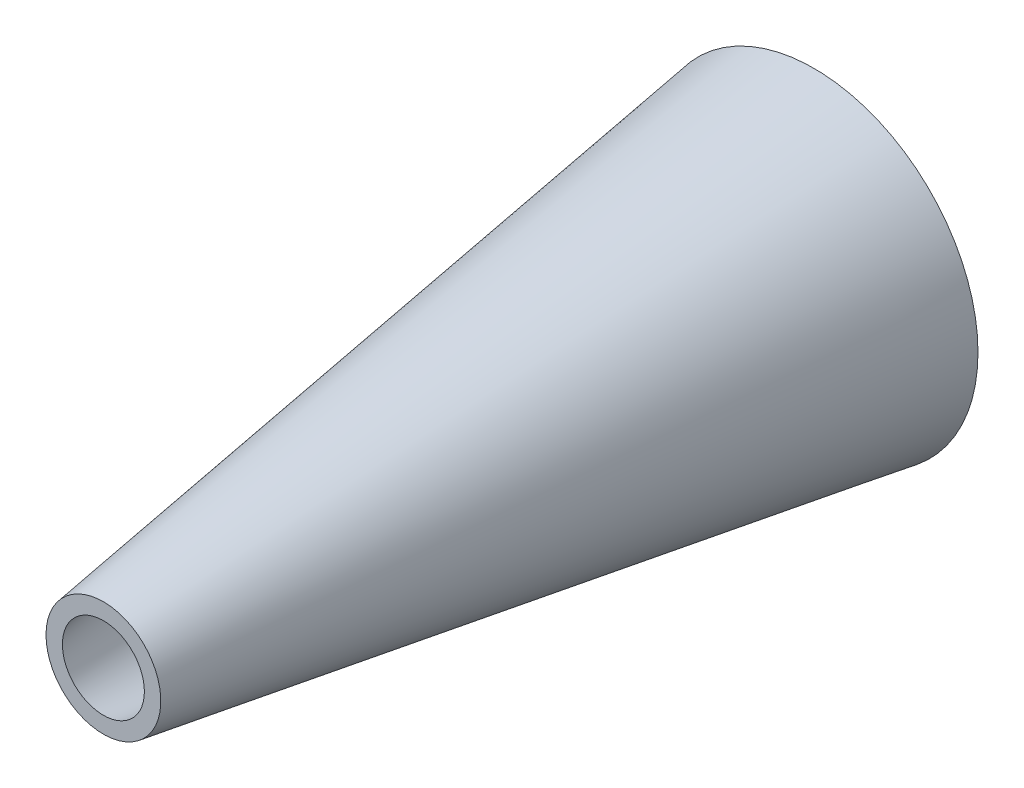
ISO-10303-21;
HEADER;
FILE_DESCRIPTION(('STEP AP214'),'2;1');
FILE_NAME('part.step','',(''),(''),'','','');
FILE_SCHEMA(('AUTOMOTIVE_DESIGN { 1 0 10303 214 1 1 1 1 }'));
ENDSEC;
DATA;
#1=APPLICATION_CONTEXT('core data for automotive mechanical design processes');
#2=APPLICATION_PROTOCOL_DEFINITION('international standard','automotive_design',2000,#1);
#3=PRODUCT_CONTEXT('',#1,'mechanical');
#4=PRODUCT('Part','Part','',(#3));
#5=PRODUCT_RELATED_PRODUCT_CATEGORY('part','',(#4));
#6=PRODUCT_DEFINITION_FORMATION('','',#4);
#7=PRODUCT_DEFINITION_CONTEXT('part definition',#1,'design');
#8=PRODUCT_DEFINITION('design','',#6,#7);
#9=PRODUCT_DEFINITION_SHAPE('','',#8);
#10=(LENGTH_UNIT() NAMED_UNIT(*) SI_UNIT(.MILLI.,.METRE.));
#11=(NAMED_UNIT(*) PLANE_ANGLE_UNIT() SI_UNIT($,.RADIAN.));
#12=(NAMED_UNIT(*) SI_UNIT($,.STERADIAN.) SOLID_ANGLE_UNIT());
#13=UNCERTAINTY_MEASURE_WITH_UNIT(LENGTH_MEASURE(1.E-05),#10,'distance_accuracy_value','');
#14=(GEOMETRIC_REPRESENTATION_CONTEXT(3) GLOBAL_UNCERTAINTY_ASSIGNED_CONTEXT((#13)) GLOBAL_UNIT_ASSIGNED_CONTEXT((#10,
#11,#12)) REPRESENTATION_CONTEXT('',''));
#15=CARTESIAN_POINT('',(0.,0.,0.));
#16=DIRECTION('',(0.,0.,1.));
#17=DIRECTION('',(1.,0.,0.));
#18=AXIS2_PLACEMENT_3D('',#15,#16,#17);
#19=CARTESIAN_POINT('',(0.,0.,0.));
#20=DIRECTION('',(0.,0.,-1.));
#21=DIRECTION('',(-1.,0.,0.));
#22=AXIS2_PLACEMENT_3D('',#19,#20,#21);
#23=CONICAL_SURFACE('',#22,90.,0.148889947609497);
#24=CARTESIAN_POINT('',(0.,0.,0.));
#25=DIRECTION('',(0.,0.,1.));
#26=DIRECTION('',(1.,0.,0.));
#27=AXIS2_PLACEMENT_3D('',#24,#25,#26);
#28=CIRCLE('',#27,90.);
#29=CARTESIAN_POINT('',(90.,0.,0.));
#30=VERTEX_POINT('',#29);
#31=EDGE_CURVE('E10',#30,#30,#28,.T.);
#32=ORIENTED_EDGE('',*,*,#31,.F.);
#33=EDGE_LOOP('',(#32));
#34=FACE_BOUND('',#33,.T.);
#35=CARTESIAN_POINT('',(0.,0.,433.333333333333));
#36=DIRECTION('',(0.,0.,1.));
#37=DIRECTION('',(1.,0.,0.));
#38=AXIS2_PLACEMENT_3D('',#35,#36,#37);
#39=CIRCLE('',#38,25.);
#40=CARTESIAN_POINT('',(25.,0.,433.333333333333));
#41=VERTEX_POINT('',#40);
#42=EDGE_CURVE('E25',#41,#41,#39,.T.);
#43=ORIENTED_EDGE('',*,*,#42,.T.);
#44=EDGE_LOOP('',(#43));
#45=FACE_BOUND('',#44,.T.);
#46=ADVANCED_FACE('F16',(#34,#45),#23,.F.);
#47=CARTESIAN_POINT('',(0.,0.,0.));
#48=DIRECTION('',(0.,0.,-1.));
#49=DIRECTION('',(0.,-1.,0.));
#50=AXIS2_PLACEMENT_3D('',#47,#48,#49);
#51=PLANE('',#50);
#52=CARTESIAN_POINT('',(0.,0.,0.));
#53=DIRECTION('',(0.,0.,1.));
#54=DIRECTION('',(1.,0.,0.));
#55=AXIS2_PLACEMENT_3D('',#52,#53,#54);
#56=CIRCLE('',#55,100.);
#57=CARTESIAN_POINT('',(100.,0.,0.));
#58=VERTEX_POINT('',#57);
#59=EDGE_CURVE('E19',#58,#58,#56,.T.);
#60=ORIENTED_EDGE('',*,*,#59,.F.);
#61=EDGE_LOOP('',(#60));
#62=FACE_BOUND('',#61,.T.);
#63=ORIENTED_EDGE('',*,*,#31,.T.);
#64=EDGE_LOOP('',(#63));
#65=FACE_BOUND('',#64,.T.);
#66=ADVANCED_FACE('F75',(#62,#65),#51,.T.);
#67=CARTESIAN_POINT('',(0.,0.,433.333333333333));
#68=DIRECTION('',(0.,0.,-1.));
#69=DIRECTION('',(0.,-1.,0.));
#70=AXIS2_PLACEMENT_3D('',#67,#68,#69);
#71=PLANE('',#70);
#72=CARTESIAN_POINT('',(0.,0.,433.333333333333));
#73=DIRECTION('',(0.,0.,1.));
#74=DIRECTION('',(-1.,0.,0.));
#75=AXIS2_PLACEMENT_3D('',#72,#73,#74);
#76=CIRCLE('',#75,35.);
#77=CARTESIAN_POINT('',(-35.,0.,433.333333333333));
#78=VERTEX_POINT('',#77);
#79=EDGE_CURVE('E49',#78,#78,#76,.T.);
#80=ORIENTED_EDGE('',*,*,#79,.T.);
#81=EDGE_LOOP('',(#80));
#82=FACE_BOUND('',#81,.T.);
#83=ORIENTED_EDGE('',*,*,#42,.F.);
#84=EDGE_LOOP('',(#83));
#85=FACE_BOUND('',#84,.T.);
#86=ADVANCED_FACE('F50',(#82,#85),#71,.F.);
#87=CARTESIAN_POINT('',(0.,0.,0.));
#88=DIRECTION('',(0.,0.,-1.));
#89=DIRECTION('',(-1.,0.,0.));
#90=AXIS2_PLACEMENT_3D('',#87,#88,#89);
#91=CONICAL_SURFACE('',#90,100.,0.148889947609497);
#92=ORIENTED_EDGE('',*,*,#59,.T.);
#93=EDGE_LOOP('',(#92));
#94=FACE_BOUND('',#93,.T.);
#95=ORIENTED_EDGE('',*,*,#79,.F.);
#96=EDGE_LOOP('',(#95));
#97=FACE_BOUND('',#96,.T.);
#98=ADVANCED_FACE('F93',(#94,#97),#91,.T.);
#99=CLOSED_SHELL('',(#46,#66,#86,#98));
#100=MANIFOLD_SOLID_BREP('B1',#99);
#101=ADVANCED_BREP_SHAPE_REPRESENTATION('',(#18,#100),#14);
#102=SHAPE_DEFINITION_REPRESENTATION(#9,#101);
ENDSEC;
END-ISO-10303-21;
